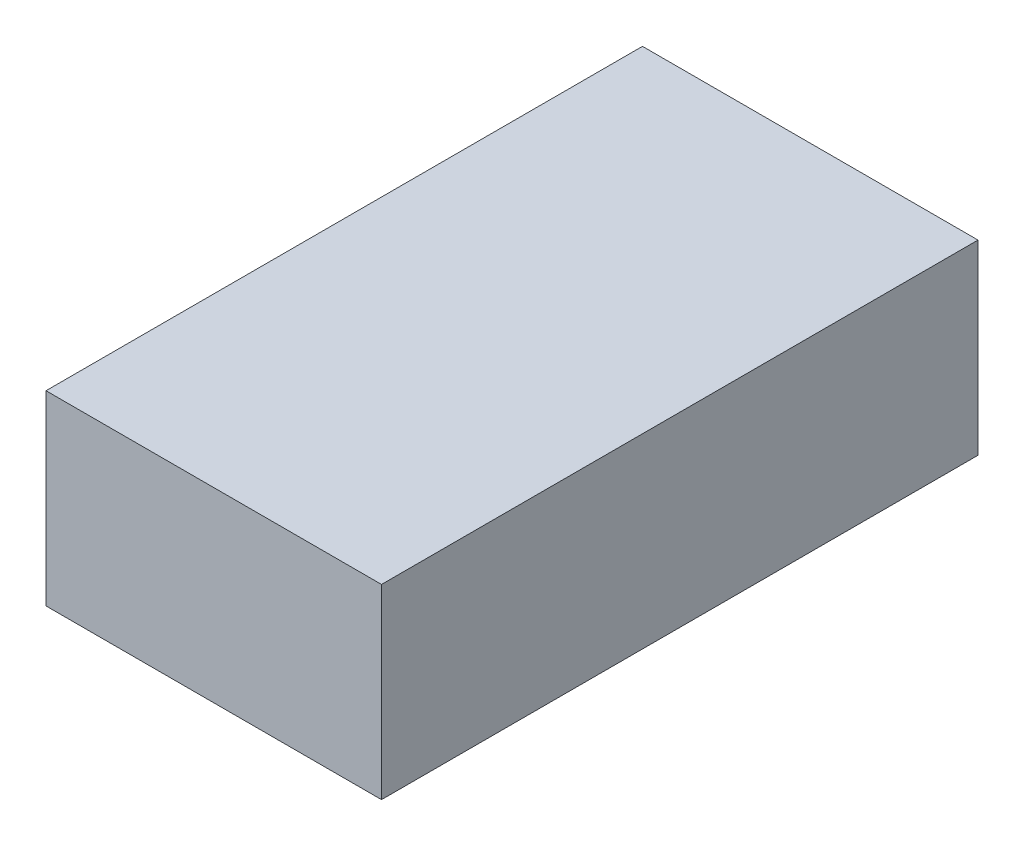
ISO-10303-21;
HEADER;
FILE_DESCRIPTION(('STEP AP214'),'2;1');
FILE_NAME('part.step','',(''),(''),'','','');
FILE_SCHEMA(('AUTOMOTIVE_DESIGN { 1 0 10303 214 1 1 1 1 }'));
ENDSEC;
DATA;
#1=APPLICATION_CONTEXT('core data for automotive mechanical design processes');
#2=APPLICATION_PROTOCOL_DEFINITION('international standard','automotive_design',2000,#1);
#3=PRODUCT_CONTEXT('',#1,'mechanical');
#4=PRODUCT('Part','Part','',(#3));
#5=PRODUCT_RELATED_PRODUCT_CATEGORY('part','',(#4));
#6=PRODUCT_DEFINITION_FORMATION('','',#4);
#7=PRODUCT_DEFINITION_CONTEXT('part definition',#1,'design');
#8=PRODUCT_DEFINITION('design','',#6,#7);
#9=PRODUCT_DEFINITION_SHAPE('','',#8);
#10=(LENGTH_UNIT() NAMED_UNIT(*) SI_UNIT(.MILLI.,.METRE.));
#11=(NAMED_UNIT(*) PLANE_ANGLE_UNIT() SI_UNIT($,.RADIAN.));
#12=(NAMED_UNIT(*) SI_UNIT($,.STERADIAN.) SOLID_ANGLE_UNIT());
#13=UNCERTAINTY_MEASURE_WITH_UNIT(LENGTH_MEASURE(1.E-05),#10,'distance_accuracy_value','');
#14=(GEOMETRIC_REPRESENTATION_CONTEXT(3) GLOBAL_UNCERTAINTY_ASSIGNED_CONTEXT((#13)) GLOBAL_UNIT_ASSIGNED_CONTEXT((#10,
#11,#12)) REPRESENTATION_CONTEXT('',''));
#15=CARTESIAN_POINT('',(0.,0.,0.));
#16=DIRECTION('',(0.,0.,1.));
#17=DIRECTION('',(1.,0.,0.));
#18=AXIS2_PLACEMENT_3D('',#15,#16,#17);
#19=CARTESIAN_POINT('',(28.575,-15.875,101.6));
#20=DIRECTION('',(-1.,0.,0.));
#21=DIRECTION('',(0.,0.,1.));
#22=AXIS2_PLACEMENT_3D('',#19,#20,#21);
#23=PLANE('',#22);
#24=DIRECTION('',(0.,1.,0.));
#25=VECTOR('',#24,1.);
#26=CARTESIAN_POINT('',(28.575,-15.875,0.));
#27=LINE('',#26,#25);
#28=CARTESIAN_POINT('',(28.575,-15.875,0.));
#29=VERTEX_POINT('',#28);
#30=CARTESIAN_POINT('',(28.575,15.875,0.));
#31=VERTEX_POINT('',#30);
#32=EDGE_CURVE('E99',#29,#31,#27,.T.);
#33=ORIENTED_EDGE('',*,*,#32,.T.);
#34=DIRECTION('',(0.,0.,-1.));
#35=VECTOR('',#34,1.);
#36=CARTESIAN_POINT('',(28.575,15.875,101.6));
#37=LINE('',#36,#35);
#38=CARTESIAN_POINT('',(28.575,15.875,101.6));
#39=VERTEX_POINT('',#38);
#40=EDGE_CURVE('E11',#39,#31,#37,.T.);
#41=ORIENTED_EDGE('',*,*,#40,.F.);
#42=DIRECTION('',(0.,1.,0.));
#43=VECTOR('',#42,1.);
#44=CARTESIAN_POINT('',(28.575,-15.875,101.6));
#45=LINE('',#44,#43);
#46=CARTESIAN_POINT('',(28.575,-15.875,101.6));
#47=VERTEX_POINT('',#46);
#48=EDGE_CURVE('E87',#47,#39,#45,.T.);
#49=ORIENTED_EDGE('',*,*,#48,.F.);
#50=DIRECTION('',(0.,0.,-1.));
#51=VECTOR('',#50,1.);
#52=CARTESIAN_POINT('',(28.575,-15.875,101.6));
#53=LINE('',#52,#51);
#54=EDGE_CURVE('E95',#47,#29,#53,.T.);
#55=ORIENTED_EDGE('',*,*,#54,.T.);
#56=EDGE_LOOP('',(#33,#41,#49,#55));
#57=FACE_BOUND('',#56,.T.);
#58=ADVANCED_FACE('F36',(#57),#23,.F.);
#59=CARTESIAN_POINT('',(-28.575,15.875,101.6));
#60=DIRECTION('',(0.,-1.,0.));
#61=DIRECTION('',(0.,0.,-1.));
#62=AXIS2_PLACEMENT_3D('',#59,#60,#61);
#63=PLANE('',#62);
#64=DIRECTION('',(-1.,0.,0.));
#65=VECTOR('',#64,1.);
#66=CARTESIAN_POINT('',(-28.575,15.875,0.));
#67=LINE('',#66,#65);
#68=CARTESIAN_POINT('',(-28.575,15.875,0.));
#69=VERTEX_POINT('',#68);
#70=EDGE_CURVE('E91',#31,#69,#67,.T.);
#71=ORIENTED_EDGE('',*,*,#70,.T.);
#72=DIRECTION('',(0.,0.,-1.));
#73=VECTOR('',#72,1.);
#74=CARTESIAN_POINT('',(-28.575,15.875,101.6));
#75=LINE('',#74,#73);
#76=CARTESIAN_POINT('',(-28.575,15.875,101.6));
#77=VERTEX_POINT('',#76);
#78=EDGE_CURVE('E44',#77,#69,#75,.T.);
#79=ORIENTED_EDGE('',*,*,#78,.F.);
#80=DIRECTION('',(-1.,0.,0.));
#81=VECTOR('',#80,1.);
#82=CARTESIAN_POINT('',(-28.575,15.875,101.6));
#83=LINE('',#82,#81);
#84=EDGE_CURVE('E82',#39,#77,#83,.T.);
#85=ORIENTED_EDGE('',*,*,#84,.F.);
#86=ORIENTED_EDGE('',*,*,#40,.T.);
#87=EDGE_LOOP('',(#71,#79,#85,#86));
#88=FACE_BOUND('',#87,.T.);
#89=ADVANCED_FACE('F90',(#88),#63,.F.);
#90=CARTESIAN_POINT('',(-28.575,-15.875,101.6));
#91=DIRECTION('',(1.,0.,0.));
#92=DIRECTION('',(0.,0.,-1.));
#93=AXIS2_PLACEMENT_3D('',#90,#91,#92);
#94=PLANE('',#93);
#95=DIRECTION('',(0.,-1.,0.));
#96=VECTOR('',#95,1.);
#97=CARTESIAN_POINT('',(-28.575,-15.875,0.));
#98=LINE('',#97,#96);
#99=CARTESIAN_POINT('',(-28.575,-15.875,0.));
#100=VERTEX_POINT('',#99);
#101=EDGE_CURVE('E69',#69,#100,#98,.T.);
#102=ORIENTED_EDGE('',*,*,#101,.T.);
#103=DIRECTION('',(0.,0.,-1.));
#104=VECTOR('',#103,1.);
#105=CARTESIAN_POINT('',(-28.575,-15.875,101.6));
#106=LINE('',#105,#104);
#107=CARTESIAN_POINT('',(-28.575,-15.875,101.6));
#108=VERTEX_POINT('',#107);
#109=EDGE_CURVE('E92',#108,#100,#106,.T.);
#110=ORIENTED_EDGE('',*,*,#109,.F.);
#111=DIRECTION('',(0.,-1.,0.));
#112=VECTOR('',#111,1.);
#113=CARTESIAN_POINT('',(-28.575,-15.875,101.6));
#114=LINE('',#113,#112);
#115=EDGE_CURVE('E85',#77,#108,#114,.T.);
#116=ORIENTED_EDGE('',*,*,#115,.F.);
#117=ORIENTED_EDGE('',*,*,#78,.T.);
#118=EDGE_LOOP('',(#102,#110,#116,#117));
#119=FACE_BOUND('',#118,.T.);
#120=ADVANCED_FACE('F93',(#119),#94,.F.);
#121=CARTESIAN_POINT('',(-28.575,-15.875,101.6));
#122=DIRECTION('',(0.,1.,0.));
#123=DIRECTION('',(0.,0.,1.));
#124=AXIS2_PLACEMENT_3D('',#121,#122,#123);
#125=PLANE('',#124);
#126=DIRECTION('',(1.,0.,0.));
#127=VECTOR('',#126,1.);
#128=CARTESIAN_POINT('',(-28.575,-15.875,0.));
#129=LINE('',#128,#127);
#130=EDGE_CURVE('E75',#100,#29,#129,.T.);
#131=ORIENTED_EDGE('',*,*,#130,.T.);
#132=ORIENTED_EDGE('',*,*,#54,.F.);
#133=DIRECTION('',(1.,0.,0.));
#134=VECTOR('',#133,1.);
#135=CARTESIAN_POINT('',(-28.575,-15.875,101.6));
#136=LINE('',#135,#134);
#137=EDGE_CURVE('E52',#108,#47,#136,.T.);
#138=ORIENTED_EDGE('',*,*,#137,.F.);
#139=ORIENTED_EDGE('',*,*,#109,.T.);
#140=EDGE_LOOP('',(#131,#132,#138,#139));
#141=FACE_BOUND('',#140,.T.);
#142=ADVANCED_FACE('F106',(#141),#125,.F.);
#143=CARTESIAN_POINT('',(0.,0.,101.6));
#144=DIRECTION('',(0.,0.,-1.));
#145=DIRECTION('',(-1.,0.,0.));
#146=AXIS2_PLACEMENT_3D('',#143,#144,#145);
#147=PLANE('',#146);
#148=ORIENTED_EDGE('',*,*,#48,.T.);
#149=ORIENTED_EDGE('',*,*,#84,.T.);
#150=ORIENTED_EDGE('',*,*,#115,.T.);
#151=ORIENTED_EDGE('',*,*,#137,.T.);
#152=EDGE_LOOP('',(#148,#149,#150,#151));
#153=FACE_BOUND('',#152,.T.);
#154=ADVANCED_FACE('F83',(#153),#147,.F.);
#155=CARTESIAN_POINT('',(0.,0.,0.));
#156=DIRECTION('',(0.,0.,-1.));
#157=DIRECTION('',(-1.,0.,0.));
#158=AXIS2_PLACEMENT_3D('',#155,#156,#157);
#159=PLANE('',#158);
#160=ORIENTED_EDGE('',*,*,#32,.F.);
#161=ORIENTED_EDGE('',*,*,#130,.F.);
#162=ORIENTED_EDGE('',*,*,#101,.F.);
#163=ORIENTED_EDGE('',*,*,#70,.F.);
#164=EDGE_LOOP('',(#160,#161,#162,#163));
#165=FACE_BOUND('',#164,.T.);
#166=ADVANCED_FACE('F109',(#165),#159,.T.);
#167=CLOSED_SHELL('',(#58,#89,#120,#142,#154,#166));
#168=MANIFOLD_SOLID_BREP('B2',#167);
#169=ADVANCED_BREP_SHAPE_REPRESENTATION('',(#18,#168),#14);
#170=SHAPE_DEFINITION_REPRESENTATION(#9,#169);
ENDSEC;
END-ISO-10303-21;
